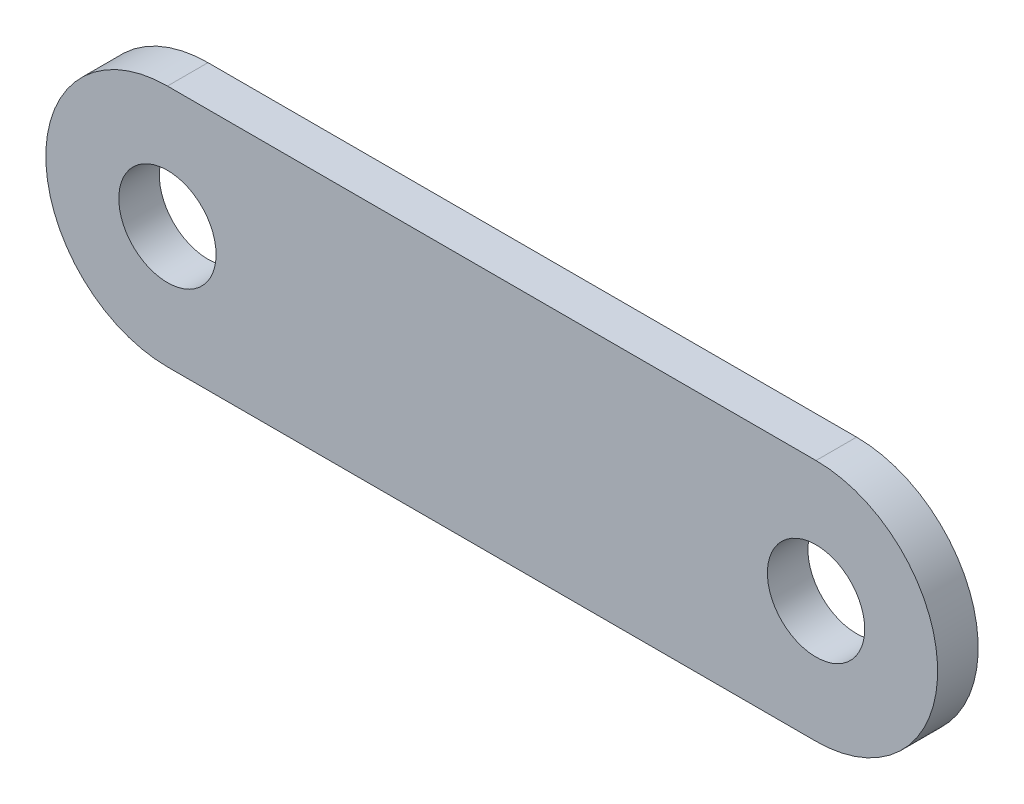
ISO-10303-21;
HEADER;
FILE_DESCRIPTION(('STEP AP214'),'2;1');
FILE_NAME('part.step','',(''),(''),'','','');
FILE_SCHEMA(('AUTOMOTIVE_DESIGN { 1 0 10303 214 1 1 1 1 }'));
ENDSEC;
DATA;
#1=APPLICATION_CONTEXT('core data for automotive mechanical design processes');
#2=APPLICATION_PROTOCOL_DEFINITION('international standard','automotive_design',2000,#1);
#3=PRODUCT_CONTEXT('',#1,'mechanical');
#4=PRODUCT('Part','Part','',(#3));
#5=PRODUCT_RELATED_PRODUCT_CATEGORY('part','',(#4));
#6=PRODUCT_DEFINITION_FORMATION('','',#4);
#7=PRODUCT_DEFINITION_CONTEXT('part definition',#1,'design');
#8=PRODUCT_DEFINITION('design','',#6,#7);
#9=PRODUCT_DEFINITION_SHAPE('','',#8);
#10=(LENGTH_UNIT() NAMED_UNIT(*) SI_UNIT(.MILLI.,.METRE.));
#11=(NAMED_UNIT(*) PLANE_ANGLE_UNIT() SI_UNIT($,.RADIAN.));
#12=(NAMED_UNIT(*) SI_UNIT($,.STERADIAN.) SOLID_ANGLE_UNIT());
#13=UNCERTAINTY_MEASURE_WITH_UNIT(LENGTH_MEASURE(1.E-05),#10,'distance_accuracy_value','');
#14=(GEOMETRIC_REPRESENTATION_CONTEXT(3) GLOBAL_UNCERTAINTY_ASSIGNED_CONTEXT((#13)) GLOBAL_UNIT_ASSIGNED_CONTEXT((#10,
#11,#12)) REPRESENTATION_CONTEXT('',''));
#15=CARTESIAN_POINT('',(0.,0.,0.));
#16=DIRECTION('',(0.,0.,1.));
#17=DIRECTION('',(1.,0.,0.));
#18=AXIS2_PLACEMENT_3D('',#15,#16,#17);
#19=CARTESIAN_POINT('',(0.,0.,2.5));
#20=DIRECTION('',(0.,0.,1.));
#21=DIRECTION('',(1.,0.,0.));
#22=AXIS2_PLACEMENT_3D('',#19,#20,#21);
#23=PLANE('',#22);
#24=CARTESIAN_POINT('',(0.,0.,2.5));
#25=DIRECTION('',(0.,0.,1.));
#26=DIRECTION('',(1.,0.,0.));
#27=AXIS2_PLACEMENT_3D('',#24,#25,#26);
#28=CIRCLE('',#27,6.);
#29=CARTESIAN_POINT('',(6.,0.,2.5));
#30=VERTEX_POINT('',#29);
#31=EDGE_CURVE('E102',#30,#30,#28,.T.);
#32=ORIENTED_EDGE('',*,*,#31,.F.);
#33=EDGE_LOOP('',(#32));
#34=FACE_BOUND('',#33,.T.);
#35=CARTESIAN_POINT('',(0.,0.,2.5));
#36=DIRECTION('',(0.,0.,1.));
#37=DIRECTION('',(1.,0.,0.));
#38=AXIS2_PLACEMENT_3D('',#35,#36,#37);
#39=CIRCLE('',#38,15.);
#40=CARTESIAN_POINT('',(0.,15.,2.5));
#41=VERTEX_POINT('',#40);
#42=CARTESIAN_POINT('',(0.,-15.,2.5));
#43=VERTEX_POINT('',#42);
#44=EDGE_CURVE('E87',#41,#43,#39,.T.);
#45=ORIENTED_EDGE('',*,*,#44,.T.);
#46=DIRECTION('',(1.,0.,0.));
#47=VECTOR('',#46,1.);
#48=CARTESIAN_POINT('',(0.,-15.,2.5));
#49=LINE('',#48,#47);
#50=CARTESIAN_POINT('',(80.,-15.,2.5));
#51=VERTEX_POINT('',#50);
#52=EDGE_CURVE('E82',#43,#51,#49,.T.);
#53=ORIENTED_EDGE('',*,*,#52,.T.);
#54=CARTESIAN_POINT('',(80.,0.,2.5));
#55=DIRECTION('',(0.,0.,1.));
#56=DIRECTION('',(1.,0.,0.));
#57=AXIS2_PLACEMENT_3D('',#54,#55,#56);
#58=CIRCLE('',#57,15.);
#59=CARTESIAN_POINT('',(80.,15.,2.5));
#60=VERTEX_POINT('',#59);
#61=EDGE_CURVE('E85',#51,#60,#58,.T.);
#62=ORIENTED_EDGE('',*,*,#61,.T.);
#63=DIRECTION('',(-1.,0.,0.));
#64=VECTOR('',#63,1.);
#65=CARTESIAN_POINT('',(0.,15.,2.5));
#66=LINE('',#65,#64);
#67=EDGE_CURVE('E52',#60,#41,#66,.T.);
#68=ORIENTED_EDGE('',*,*,#67,.T.);
#69=EDGE_LOOP('',(#45,#53,#62,#68));
#70=FACE_BOUND('',#69,.T.);
#71=CARTESIAN_POINT('',(80.,0.,2.5));
#72=DIRECTION('',(0.,0.,1.));
#73=DIRECTION('',(1.,0.,0.));
#74=AXIS2_PLACEMENT_3D('',#71,#72,#73);
#75=CIRCLE('',#74,5.99999999999999);
#76=CARTESIAN_POINT('',(86.,0.,2.5));
#77=VERTEX_POINT('',#76);
#78=EDGE_CURVE('E117',#77,#77,#75,.T.);
#79=ORIENTED_EDGE('',*,*,#78,.F.);
#80=EDGE_LOOP('',(#79));
#81=FACE_BOUND('',#80,.T.);
#82=ADVANCED_FACE('F35',(#34,#70,#81),#23,.T.);
#83=CARTESIAN_POINT('',(0.,0.,-2.5));
#84=DIRECTION('',(0.,0.,1.));
#85=DIRECTION('',(1.,0.,0.));
#86=AXIS2_PLACEMENT_3D('',#83,#84,#85);
#87=PLANE('',#86);
#88=CARTESIAN_POINT('',(0.,0.,-2.5));
#89=DIRECTION('',(0.,0.,1.));
#90=DIRECTION('',(1.,0.,0.));
#91=AXIS2_PLACEMENT_3D('',#88,#89,#90);
#92=CIRCLE('',#91,15.);
#93=CARTESIAN_POINT('',(0.,15.,-2.5));
#94=VERTEX_POINT('',#93);
#95=CARTESIAN_POINT('',(0.,-15.,-2.5));
#96=VERTEX_POINT('',#95);
#97=EDGE_CURVE('E99',#94,#96,#92,.T.);
#98=ORIENTED_EDGE('',*,*,#97,.F.);
#99=DIRECTION('',(-1.,0.,0.));
#100=VECTOR('',#99,1.);
#101=CARTESIAN_POINT('',(0.,15.,-2.5));
#102=LINE('',#101,#100);
#103=CARTESIAN_POINT('',(80.,15.,-2.5));
#104=VERTEX_POINT('',#103);
#105=EDGE_CURVE('E75',#104,#94,#102,.T.);
#106=ORIENTED_EDGE('',*,*,#105,.F.);
#107=CARTESIAN_POINT('',(80.,0.,-2.5));
#108=DIRECTION('',(0.,0.,1.));
#109=DIRECTION('',(1.,0.,0.));
#110=AXIS2_PLACEMENT_3D('',#107,#108,#109);
#111=CIRCLE('',#110,15.);
#112=CARTESIAN_POINT('',(80.,-15.,-2.5));
#113=VERTEX_POINT('',#112);
#114=EDGE_CURVE('E69',#113,#104,#111,.T.);
#115=ORIENTED_EDGE('',*,*,#114,.F.);
#116=DIRECTION('',(1.,0.,0.));
#117=VECTOR('',#116,1.);
#118=CARTESIAN_POINT('',(0.,-15.,-2.5));
#119=LINE('',#118,#117);
#120=EDGE_CURVE('E91',#96,#113,#119,.T.);
#121=ORIENTED_EDGE('',*,*,#120,.F.);
#122=EDGE_LOOP('',(#98,#106,#115,#121));
#123=FACE_BOUND('',#122,.T.);
#124=CARTESIAN_POINT('',(0.,0.,-2.5));
#125=DIRECTION('',(0.,0.,1.));
#126=DIRECTION('',(1.,0.,0.));
#127=AXIS2_PLACEMENT_3D('',#124,#125,#126);
#128=CIRCLE('',#127,6.);
#129=CARTESIAN_POINT('',(6.,0.,-2.5));
#130=VERTEX_POINT('',#129);
#131=EDGE_CURVE('E114',#130,#130,#128,.T.);
#132=ORIENTED_EDGE('',*,*,#131,.T.);
#133=EDGE_LOOP('',(#132));
#134=FACE_BOUND('',#133,.T.);
#135=CARTESIAN_POINT('',(80.,0.,-2.5));
#136=DIRECTION('',(0.,0.,1.));
#137=DIRECTION('',(1.,0.,0.));
#138=AXIS2_PLACEMENT_3D('',#135,#136,#137);
#139=CIRCLE('',#138,5.99999999999999);
#140=CARTESIAN_POINT('',(86.,0.,-2.5));
#141=VERTEX_POINT('',#140);
#142=EDGE_CURVE('E120',#141,#141,#139,.T.);
#143=ORIENTED_EDGE('',*,*,#142,.T.);
#144=EDGE_LOOP('',(#143));
#145=FACE_BOUND('',#144,.T.);
#146=ADVANCED_FACE('F110',(#123,#134,#145),#87,.F.);
#147=CARTESIAN_POINT('',(0.,0.,2.5));
#148=DIRECTION('',(0.,0.,-1.));
#149=DIRECTION('',(-1.,0.,0.));
#150=AXIS2_PLACEMENT_3D('',#147,#148,#149);
#151=CYLINDRICAL_SURFACE('',#150,15.);
#152=ORIENTED_EDGE('',*,*,#97,.T.);
#153=DIRECTION('',(0.,0.,-1.));
#154=VECTOR('',#153,1.);
#155=CARTESIAN_POINT('',(0.,-15.,2.5));
#156=LINE('',#155,#154);
#157=EDGE_CURVE('E11',#43,#96,#156,.T.);
#158=ORIENTED_EDGE('',*,*,#157,.F.);
#159=ORIENTED_EDGE('',*,*,#44,.F.);
#160=DIRECTION('',(0.,0.,-1.));
#161=VECTOR('',#160,1.);
#162=CARTESIAN_POINT('',(0.,15.,2.5));
#163=LINE('',#162,#161);
#164=EDGE_CURVE('E95',#41,#94,#163,.T.);
#165=ORIENTED_EDGE('',*,*,#164,.T.);
#166=EDGE_LOOP('',(#152,#158,#159,#165));
#167=FACE_BOUND('',#166,.T.);
#168=ADVANCED_FACE('F37',(#167),#151,.T.);
#169=CARTESIAN_POINT('',(0.,-15.,2.5));
#170=DIRECTION('',(0.,1.,0.));
#171=DIRECTION('',(0.,0.,1.));
#172=AXIS2_PLACEMENT_3D('',#169,#170,#171);
#173=PLANE('',#172);
#174=ORIENTED_EDGE('',*,*,#120,.T.);
#175=DIRECTION('',(0.,0.,-1.));
#176=VECTOR('',#175,1.);
#177=CARTESIAN_POINT('',(80.,-15.,2.5));
#178=LINE('',#177,#176);
#179=EDGE_CURVE('E44',#51,#113,#178,.T.);
#180=ORIENTED_EDGE('',*,*,#179,.F.);
#181=ORIENTED_EDGE('',*,*,#52,.F.);
#182=ORIENTED_EDGE('',*,*,#157,.T.);
#183=EDGE_LOOP('',(#174,#180,#181,#182));
#184=FACE_BOUND('',#183,.T.);
#185=ADVANCED_FACE('F90',(#184),#173,.F.);
#186=CARTESIAN_POINT('',(80.,0.,2.5));
#187=DIRECTION('',(0.,0.,-1.));
#188=DIRECTION('',(-1.,0.,0.));
#189=AXIS2_PLACEMENT_3D('',#186,#187,#188);
#190=CYLINDRICAL_SURFACE('',#189,15.);
#191=ORIENTED_EDGE('',*,*,#114,.T.);
#192=DIRECTION('',(0.,0.,-1.));
#193=VECTOR('',#192,1.);
#194=CARTESIAN_POINT('',(80.,15.,2.5));
#195=LINE('',#194,#193);
#196=EDGE_CURVE('E92',#60,#104,#195,.T.);
#197=ORIENTED_EDGE('',*,*,#196,.F.);
#198=ORIENTED_EDGE('',*,*,#61,.F.);
#199=ORIENTED_EDGE('',*,*,#179,.T.);
#200=EDGE_LOOP('',(#191,#197,#198,#199));
#201=FACE_BOUND('',#200,.T.);
#202=ADVANCED_FACE('F93',(#201),#190,.T.);
#203=CARTESIAN_POINT('',(0.,15.,2.5));
#204=DIRECTION('',(0.,-1.,0.));
#205=DIRECTION('',(0.,0.,-1.));
#206=AXIS2_PLACEMENT_3D('',#203,#204,#205);
#207=PLANE('',#206);
#208=ORIENTED_EDGE('',*,*,#105,.T.);
#209=ORIENTED_EDGE('',*,*,#164,.F.);
#210=ORIENTED_EDGE('',*,*,#67,.F.);
#211=ORIENTED_EDGE('',*,*,#196,.T.);
#212=EDGE_LOOP('',(#208,#209,#210,#211));
#213=FACE_BOUND('',#212,.T.);
#214=ADVANCED_FACE('F107',(#213),#207,.F.);
#215=CARTESIAN_POINT('',(0.,0.,2.5));
#216=DIRECTION('',(0.,0.,-1.));
#217=DIRECTION('',(-1.,0.,0.));
#218=AXIS2_PLACEMENT_3D('',#215,#216,#217);
#219=CYLINDRICAL_SURFACE('',#218,6.);
#220=ORIENTED_EDGE('',*,*,#31,.T.);
#221=EDGE_LOOP('',(#220));
#222=FACE_BOUND('',#221,.T.);
#223=ORIENTED_EDGE('',*,*,#131,.F.);
#224=EDGE_LOOP('',(#223));
#225=FACE_BOUND('',#224,.T.);
#226=ADVANCED_FACE('F137',(#222,#225),#219,.F.);
#227=CARTESIAN_POINT('',(80.,0.,2.5));
#228=DIRECTION('',(0.,0.,-1.));
#229=DIRECTION('',(-1.,0.,0.));
#230=AXIS2_PLACEMENT_3D('',#227,#228,#229);
#231=CYLINDRICAL_SURFACE('',#230,5.99999999999999);
#232=ORIENTED_EDGE('',*,*,#78,.T.);
#233=EDGE_LOOP('',(#232));
#234=FACE_BOUND('',#233,.T.);
#235=ORIENTED_EDGE('',*,*,#142,.F.);
#236=EDGE_LOOP('',(#235));
#237=FACE_BOUND('',#236,.T.);
#238=ADVANCED_FACE('F126',(#234,#237),#231,.F.);
#239=CLOSED_SHELL('',(#82,#146,#168,#185,#202,#214,#226,#238));
#240=MANIFOLD_SOLID_BREP('B2',#239);
#241=ADVANCED_BREP_SHAPE_REPRESENTATION('',(#18,#240),#14);
#242=SHAPE_DEFINITION_REPRESENTATION(#9,#241);
ENDSEC;
END-ISO-10303-21;
